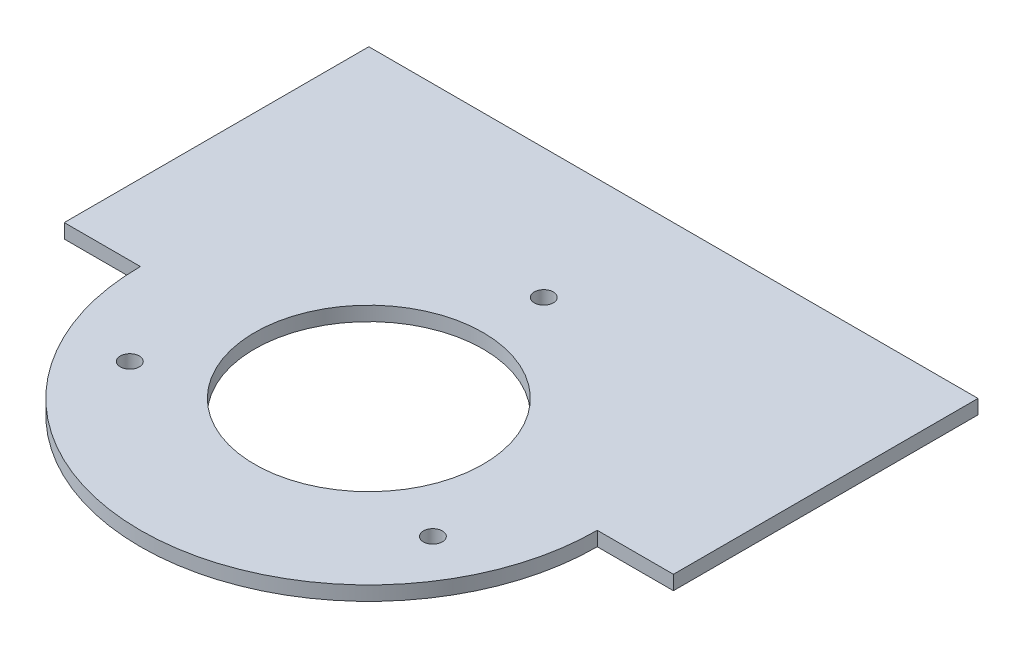
ISO-10303-21;
HEADER;
FILE_DESCRIPTION(('STEP AP214'),'2;1');
FILE_NAME('part.step','',(''),(''),'','','');
FILE_SCHEMA(('AUTOMOTIVE_DESIGN { 1 0 10303 214 1 1 1 1 }'));
ENDSEC;
DATA;
#1=APPLICATION_CONTEXT('core data for automotive mechanical design processes');
#2=APPLICATION_PROTOCOL_DEFINITION('international standard','automotive_design',2000,#1);
#3=PRODUCT_CONTEXT('',#1,'mechanical');
#4=PRODUCT('Part','Part','',(#3));
#5=PRODUCT_RELATED_PRODUCT_CATEGORY('part','',(#4));
#6=PRODUCT_DEFINITION_FORMATION('','',#4);
#7=PRODUCT_DEFINITION_CONTEXT('part definition',#1,'design');
#8=PRODUCT_DEFINITION('design','',#6,#7);
#9=PRODUCT_DEFINITION_SHAPE('','',#8);
#10=(LENGTH_UNIT() NAMED_UNIT(*) SI_UNIT(.MILLI.,.METRE.));
#11=(NAMED_UNIT(*) PLANE_ANGLE_UNIT() SI_UNIT($,.RADIAN.));
#12=(NAMED_UNIT(*) SI_UNIT($,.STERADIAN.) SOLID_ANGLE_UNIT());
#13=UNCERTAINTY_MEASURE_WITH_UNIT(LENGTH_MEASURE(1.E-05),#10,'distance_accuracy_value','');
#14=(GEOMETRIC_REPRESENTATION_CONTEXT(3) GLOBAL_UNCERTAINTY_ASSIGNED_CONTEXT((#13)) GLOBAL_UNIT_ASSIGNED_CONTEXT((#10,
#11,#12)) REPRESENTATION_CONTEXT('',''));
#15=CARTESIAN_POINT('',(0.,0.,0.));
#16=DIRECTION('',(0.,0.,1.));
#17=DIRECTION('',(1.,0.,0.));
#18=AXIS2_PLACEMENT_3D('',#15,#16,#17);
#19=CARTESIAN_POINT('',(0.,4.7625,0.));
#20=DIRECTION('',(0.,1.,0.));
#21=DIRECTION('',(0.,0.,1.));
#22=AXIS2_PLACEMENT_3D('',#19,#20,#21);
#23=PLANE('',#22);
#24=CARTESIAN_POINT('',(50.546,4.7625,29.1827467064591));
#25=DIRECTION('',(0.,1.,0.));
#26=DIRECTION('',(0.,0.,1.));
#27=AXIS2_PLACEMENT_3D('',#24,#25,#26);
#28=CIRCLE('',#27,3.17499999999998);
#29=CARTESIAN_POINT('',(50.546,4.7625,26.0077467064592));
#30=VERTEX_POINT('',#29);
#31=EDGE_CURVE('E189',#30,#30,#28,.T.);
#32=ORIENTED_EDGE('',*,*,#31,.F.);
#33=EDGE_LOOP('',(#32));
#34=FACE_BOUND('',#33,.T.);
#35=CARTESIAN_POINT('',(0.,4.7625,-58.3654934129178));
#36=DIRECTION('',(0.,1.,0.));
#37=DIRECTION('',(0.,0.,1.));
#38=AXIS2_PLACEMENT_3D('',#35,#36,#37);
#39=CIRCLE('',#38,3.175);
#40=CARTESIAN_POINT('',(0.,4.7625,-61.5404934129178));
#41=VERTEX_POINT('',#40);
#42=EDGE_CURVE('E122',#41,#41,#39,.T.);
#43=ORIENTED_EDGE('',*,*,#42,.F.);
#44=EDGE_LOOP('',(#43));
#45=FACE_BOUND('',#44,.T.);
#46=DIRECTION('',(1.,0.,0.));
#47=VECTOR('',#46,1.);
#48=CARTESIAN_POINT('',(-76.2,4.7625,0.));
#49=LINE('',#48,#47);
#50=CARTESIAN_POINT('',(-101.6,4.7625,0.));
#51=VERTEX_POINT('',#50);
#52=CARTESIAN_POINT('',(-76.2,4.7625,0.));
#53=VERTEX_POINT('',#52);
#54=EDGE_CURVE('E129',#51,#53,#49,.T.);
#55=ORIENTED_EDGE('',*,*,#54,.T.);
#56=CARTESIAN_POINT('',(0.,4.7625,0.));
#57=DIRECTION('',(0.,1.,0.));
#58=DIRECTION('',(0.,0.,1.));
#59=AXIS2_PLACEMENT_3D('',#56,#57,#58);
#60=CIRCLE('',#59,76.2);
#61=CARTESIAN_POINT('',(76.2,4.7625,0.));
#62=VERTEX_POINT('',#61);
#63=EDGE_CURVE('E87',#53,#62,#60,.T.);
#64=ORIENTED_EDGE('',*,*,#63,.T.);
#65=DIRECTION('',(1.,0.,0.));
#66=VECTOR('',#65,1.);
#67=CARTESIAN_POINT('',(76.2,4.7625,0.));
#68=LINE('',#67,#66);
#69=CARTESIAN_POINT('',(101.6,4.7625,0.));
#70=VERTEX_POINT('',#69);
#71=EDGE_CURVE('E100',#62,#70,#68,.T.);
#72=ORIENTED_EDGE('',*,*,#71,.T.);
#73=DIRECTION('',(0.,0.,-1.));
#74=VECTOR('',#73,1.);
#75=CARTESIAN_POINT('',(101.6,4.7625,-101.6));
#76=LINE('',#75,#74);
#77=CARTESIAN_POINT('',(101.6,4.7625,-101.6));
#78=VERTEX_POINT('',#77);
#79=EDGE_CURVE('E94',#70,#78,#76,.T.);
#80=ORIENTED_EDGE('',*,*,#79,.T.);
#81=DIRECTION('',(-1.,0.,0.));
#82=VECTOR('',#81,1.);
#83=CARTESIAN_POINT('',(-101.6,4.7625,-101.6));
#84=LINE('',#83,#82);
#85=CARTESIAN_POINT('',(-101.6,4.7625,-101.6));
#86=VERTEX_POINT('',#85);
#87=EDGE_CURVE('E98',#78,#86,#84,.T.);
#88=ORIENTED_EDGE('',*,*,#87,.T.);
#89=DIRECTION('',(0.,0.,1.));
#90=VECTOR('',#89,1.);
#91=CARTESIAN_POINT('',(-101.6,4.7625,0.));
#92=LINE('',#91,#90);
#93=EDGE_CURVE('E50',#86,#51,#92,.T.);
#94=ORIENTED_EDGE('',*,*,#93,.T.);
#95=EDGE_LOOP('',(#55,#64,#72,#80,#88,#94));
#96=FACE_BOUND('',#95,.T.);
#97=CARTESIAN_POINT('',(-50.546,4.7625,29.1827467064592));
#98=DIRECTION('',(0.,1.,0.));
#99=DIRECTION('',(0.,0.,1.));
#100=AXIS2_PLACEMENT_3D('',#97,#98,#99);
#101=CIRCLE('',#100,3.175);
#102=CARTESIAN_POINT('',(-50.546,4.7625,26.0077467064592));
#103=VERTEX_POINT('',#102);
#104=EDGE_CURVE('E195',#103,#103,#101,.T.);
#105=ORIENTED_EDGE('',*,*,#104,.F.);
#106=EDGE_LOOP('',(#105));
#107=FACE_BOUND('',#106,.T.);
#108=CARTESIAN_POINT('',(0.,4.7625,0.));
#109=DIRECTION('',(0.,1.,0.));
#110=DIRECTION('',(0.,0.,1.));
#111=AXIS2_PLACEMENT_3D('',#108,#109,#110);
#112=CIRCLE('',#111,38.1);
#113=CARTESIAN_POINT('',(0.,4.7625,-38.1));
#114=VERTEX_POINT('',#113);
#115=EDGE_CURVE('E180',#114,#114,#112,.T.);
#116=ORIENTED_EDGE('',*,*,#115,.F.);
#117=EDGE_LOOP('',(#116));
#118=FACE_BOUND('',#117,.T.);
#119=ADVANCED_FACE('F33',(#34,#45,#96,#107,#118),#23,.T.);
#120=CARTESIAN_POINT('',(0.,0.,0.));
#121=DIRECTION('',(0.,1.,0.));
#122=DIRECTION('',(0.,0.,1.));
#123=AXIS2_PLACEMENT_3D('',#120,#121,#122);
#124=PLANE('',#123);
#125=DIRECTION('',(1.,0.,0.));
#126=VECTOR('',#125,1.);
#127=CARTESIAN_POINT('',(-76.2,0.,0.));
#128=LINE('',#127,#126);
#129=CARTESIAN_POINT('',(-101.6,0.,0.));
#130=VERTEX_POINT('',#129);
#131=CARTESIAN_POINT('',(-76.2,0.,0.));
#132=VERTEX_POINT('',#131);
#133=EDGE_CURVE('E118',#130,#132,#128,.T.);
#134=ORIENTED_EDGE('',*,*,#133,.F.);
#135=DIRECTION('',(0.,0.,1.));
#136=VECTOR('',#135,1.);
#137=CARTESIAN_POINT('',(-101.6,0.,0.));
#138=LINE('',#137,#136);
#139=CARTESIAN_POINT('',(-101.6,0.,-101.6));
#140=VERTEX_POINT('',#139);
#141=EDGE_CURVE('E79',#140,#130,#138,.T.);
#142=ORIENTED_EDGE('',*,*,#141,.F.);
#143=DIRECTION('',(-1.,0.,0.));
#144=VECTOR('',#143,1.);
#145=CARTESIAN_POINT('',(-101.6,0.,-101.6));
#146=LINE('',#145,#144);
#147=CARTESIAN_POINT('',(101.6,0.,-101.6));
#148=VERTEX_POINT('',#147);
#149=EDGE_CURVE('E73',#148,#140,#146,.T.);
#150=ORIENTED_EDGE('',*,*,#149,.F.);
#151=DIRECTION('',(0.,0.,-1.));
#152=VECTOR('',#151,1.);
#153=CARTESIAN_POINT('',(101.6,0.,-101.6));
#154=LINE('',#153,#152);
#155=CARTESIAN_POINT('',(101.6,0.,0.));
#156=VERTEX_POINT('',#155);
#157=EDGE_CURVE('E108',#156,#148,#154,.T.);
#158=ORIENTED_EDGE('',*,*,#157,.F.);
#159=DIRECTION('',(1.,0.,0.));
#160=VECTOR('',#159,1.);
#161=CARTESIAN_POINT('',(76.2,0.,0.));
#162=LINE('',#161,#160);
#163=CARTESIAN_POINT('',(76.2,0.,0.));
#164=VERTEX_POINT('',#163);
#165=EDGE_CURVE('E124',#164,#156,#162,.T.);
#166=ORIENTED_EDGE('',*,*,#165,.F.);
#167=CARTESIAN_POINT('',(0.,0.,0.));
#168=DIRECTION('',(0.,1.,0.));
#169=DIRECTION('',(0.,0.,1.));
#170=AXIS2_PLACEMENT_3D('',#167,#168,#169);
#171=CIRCLE('',#170,76.2);
#172=EDGE_CURVE('E121',#132,#164,#171,.T.);
#173=ORIENTED_EDGE('',*,*,#172,.F.);
#174=EDGE_LOOP('',(#134,#142,#150,#158,#166,#173));
#175=FACE_BOUND('',#174,.T.);
#176=CARTESIAN_POINT('',(0.,0.,-58.3654934129178));
#177=DIRECTION('',(0.,1.,0.));
#178=DIRECTION('',(0.,0.,1.));
#179=AXIS2_PLACEMENT_3D('',#176,#177,#178);
#180=CIRCLE('',#179,3.175);
#181=CARTESIAN_POINT('',(0.,0.,-61.5404934129178));
#182=VERTEX_POINT('',#181);
#183=EDGE_CURVE('E198',#182,#182,#180,.T.);
#184=ORIENTED_EDGE('',*,*,#183,.T.);
#185=EDGE_LOOP('',(#184));
#186=FACE_BOUND('',#185,.T.);
#187=CARTESIAN_POINT('',(-50.546,0.,29.1827467064592));
#188=DIRECTION('',(0.,1.,0.));
#189=DIRECTION('',(0.,0.,1.));
#190=AXIS2_PLACEMENT_3D('',#187,#188,#189);
#191=CIRCLE('',#190,3.175);
#192=CARTESIAN_POINT('',(-50.546,0.,26.0077467064592));
#193=VERTEX_POINT('',#192);
#194=EDGE_CURVE('E192',#193,#193,#191,.T.);
#195=ORIENTED_EDGE('',*,*,#194,.T.);
#196=EDGE_LOOP('',(#195));
#197=FACE_BOUND('',#196,.T.);
#198=CARTESIAN_POINT('',(50.546,0.,29.1827467064591));
#199=DIRECTION('',(0.,1.,0.));
#200=DIRECTION('',(0.,0.,1.));
#201=AXIS2_PLACEMENT_3D('',#198,#199,#200);
#202=CIRCLE('',#201,3.17499999999998);
#203=CARTESIAN_POINT('',(50.546,0.,26.0077467064592));
#204=VERTEX_POINT('',#203);
#205=EDGE_CURVE('E186',#204,#204,#202,.T.);
#206=ORIENTED_EDGE('',*,*,#205,.T.);
#207=EDGE_LOOP('',(#206));
#208=FACE_BOUND('',#207,.T.);
#209=CARTESIAN_POINT('',(0.,0.,0.));
#210=DIRECTION('',(0.,1.,0.));
#211=DIRECTION('',(0.,0.,1.));
#212=AXIS2_PLACEMENT_3D('',#209,#210,#211);
#213=CIRCLE('',#212,38.1);
#214=CARTESIAN_POINT('',(0.,0.,-38.1));
#215=VERTEX_POINT('',#214);
#216=EDGE_CURVE('E183',#215,#215,#213,.T.);
#217=ORIENTED_EDGE('',*,*,#216,.T.);
#218=EDGE_LOOP('',(#217));
#219=FACE_BOUND('',#218,.T.);
#220=ADVANCED_FACE('F138',(#175,#186,#197,#208,#219),#124,.F.);
#221=CARTESIAN_POINT('',(-76.2,4.7625,0.));
#222=DIRECTION('',(0.,0.,-1.));
#223=DIRECTION('',(-1.,0.,0.));
#224=AXIS2_PLACEMENT_3D('',#221,#222,#223);
#225=PLANE('',#224);
#226=ORIENTED_EDGE('',*,*,#133,.T.);
#227=DIRECTION('',(0.,-1.,0.));
#228=VECTOR('',#227,1.);
#229=CARTESIAN_POINT('',(-76.2,4.7625,0.));
#230=LINE('',#229,#228);
#231=EDGE_CURVE('E11',#53,#132,#230,.T.);
#232=ORIENTED_EDGE('',*,*,#231,.F.);
#233=ORIENTED_EDGE('',*,*,#54,.F.);
#234=DIRECTION('',(0.,-1.,0.));
#235=VECTOR('',#234,1.);
#236=CARTESIAN_POINT('',(-101.6,4.7625,0.));
#237=LINE('',#236,#235);
#238=EDGE_CURVE('E114',#51,#130,#237,.T.);
#239=ORIENTED_EDGE('',*,*,#238,.T.);
#240=EDGE_LOOP('',(#226,#232,#233,#239));
#241=FACE_BOUND('',#240,.T.);
#242=ADVANCED_FACE('F35',(#241),#225,.F.);
#243=CARTESIAN_POINT('',(0.,4.7625,0.));
#244=DIRECTION('',(0.,-1.,0.));
#245=DIRECTION('',(0.,0.,-1.));
#246=AXIS2_PLACEMENT_3D('',#243,#244,#245);
#247=CYLINDRICAL_SURFACE('',#246,76.2);
#248=ORIENTED_EDGE('',*,*,#172,.T.);
#249=DIRECTION('',(0.,-1.,0.));
#250=VECTOR('',#249,1.);
#251=CARTESIAN_POINT('',(76.2,4.7625,0.));
#252=LINE('',#251,#250);
#253=EDGE_CURVE('E42',#62,#164,#252,.T.);
#254=ORIENTED_EDGE('',*,*,#253,.F.);
#255=ORIENTED_EDGE('',*,*,#63,.F.);
#256=ORIENTED_EDGE('',*,*,#231,.T.);
#257=EDGE_LOOP('',(#248,#254,#255,#256));
#258=FACE_BOUND('',#257,.T.);
#259=ADVANCED_FACE('F256',(#258),#247,.T.);
#260=CARTESIAN_POINT('',(76.2,4.7625,0.));
#261=DIRECTION('',(0.,0.,-1.));
#262=DIRECTION('',(-1.,0.,0.));
#263=AXIS2_PLACEMENT_3D('',#260,#261,#262);
#264=PLANE('',#263);
#265=ORIENTED_EDGE('',*,*,#165,.T.);
#266=DIRECTION('',(0.,-1.,0.));
#267=VECTOR('',#266,1.);
#268=CARTESIAN_POINT('',(101.6,4.7625,0.));
#269=LINE('',#268,#267);
#270=EDGE_CURVE('E109',#70,#156,#269,.T.);
#271=ORIENTED_EDGE('',*,*,#270,.F.);
#272=ORIENTED_EDGE('',*,*,#71,.F.);
#273=ORIENTED_EDGE('',*,*,#253,.T.);
#274=EDGE_LOOP('',(#265,#271,#272,#273));
#275=FACE_BOUND('',#274,.T.);
#276=ADVANCED_FACE('F135',(#275),#264,.F.);
#277=CARTESIAN_POINT('',(101.6,4.7625,-101.6));
#278=DIRECTION('',(-1.,0.,0.));
#279=DIRECTION('',(0.,0.,1.));
#280=AXIS2_PLACEMENT_3D('',#277,#278,#279);
#281=PLANE('',#280);
#282=ORIENTED_EDGE('',*,*,#157,.T.);
#283=DIRECTION('',(0.,-1.,0.));
#284=VECTOR('',#283,1.);
#285=CARTESIAN_POINT('',(101.6,4.7625,-101.6));
#286=LINE('',#285,#284);
#287=EDGE_CURVE('E105',#78,#148,#286,.T.);
#288=ORIENTED_EDGE('',*,*,#287,.F.);
#289=ORIENTED_EDGE('',*,*,#79,.F.);
#290=ORIENTED_EDGE('',*,*,#270,.T.);
#291=EDGE_LOOP('',(#282,#288,#289,#290));
#292=FACE_BOUND('',#291,.T.);
#293=ADVANCED_FACE('F106',(#292),#281,.F.);
#294=CARTESIAN_POINT('',(-101.6,4.7625,-101.6));
#295=DIRECTION('',(0.,0.,1.));
#296=DIRECTION('',(1.,0.,0.));
#297=AXIS2_PLACEMENT_3D('',#294,#295,#296);
#298=PLANE('',#297);
#299=ORIENTED_EDGE('',*,*,#149,.T.);
#300=DIRECTION('',(0.,-1.,0.));
#301=VECTOR('',#300,1.);
#302=CARTESIAN_POINT('',(-101.6,4.7625,-101.6));
#303=LINE('',#302,#301);
#304=EDGE_CURVE('E110',#86,#140,#303,.T.);
#305=ORIENTED_EDGE('',*,*,#304,.F.);
#306=ORIENTED_EDGE('',*,*,#87,.F.);
#307=ORIENTED_EDGE('',*,*,#287,.T.);
#308=EDGE_LOOP('',(#299,#305,#306,#307));
#309=FACE_BOUND('',#308,.T.);
#310=ADVANCED_FACE('F112',(#309),#298,.F.);
#311=CARTESIAN_POINT('',(-101.6,4.7625,0.));
#312=DIRECTION('',(1.,0.,0.));
#313=DIRECTION('',(0.,0.,-1.));
#314=AXIS2_PLACEMENT_3D('',#311,#312,#313);
#315=PLANE('',#314);
#316=ORIENTED_EDGE('',*,*,#141,.T.);
#317=ORIENTED_EDGE('',*,*,#238,.F.);
#318=ORIENTED_EDGE('',*,*,#93,.F.);
#319=ORIENTED_EDGE('',*,*,#304,.T.);
#320=EDGE_LOOP('',(#316,#317,#318,#319));
#321=FACE_BOUND('',#320,.T.);
#322=ADVANCED_FACE('F143',(#321),#315,.F.);
#323=CARTESIAN_POINT('',(0.,4.7625,-58.3654934129178));
#324=DIRECTION('',(0.,-1.,0.));
#325=DIRECTION('',(0.,0.,-1.));
#326=AXIS2_PLACEMENT_3D('',#323,#324,#325);
#327=CYLINDRICAL_SURFACE('',#326,3.175);
#328=CARTESIAN_POINT('',(0.,4.7625,-61.5404934129178));
#329=CARTESIAN_POINT('',(0.,4.712890625,-61.5404934129178));
#330=CARTESIAN_POINT('',(0.,4.66328125,-61.5404934129178));
#331=CARTESIAN_POINT('',(0.,4.5640625,-61.5404934129178));
#332=CARTESIAN_POINT('',(0.,4.514453125,-61.5404934129178));
#333=CARTESIAN_POINT('',(0.,4.415234375,-61.5404934129178));
#334=CARTESIAN_POINT('',(0.,4.365625,-61.5404934129178));
#335=CARTESIAN_POINT('',(0.,4.26640625,-61.5404934129178));
#336=CARTESIAN_POINT('',(0.,4.216796875,-61.5404934129178));
#337=CARTESIAN_POINT('',(0.,4.117578125,-61.5404934129178));
#338=CARTESIAN_POINT('',(0.,4.06796875,-61.5404934129178));
#339=CARTESIAN_POINT('',(0.,3.96875,-61.5404934129178));
#340=CARTESIAN_POINT('',(0.,3.919140625,-61.5404934129178));
#341=CARTESIAN_POINT('',(0.,3.819921875,-61.5404934129178));
#342=CARTESIAN_POINT('',(0.,3.7703125,-61.5404934129178));
#343=CARTESIAN_POINT('',(0.,3.67109375,-61.5404934129178));
#344=CARTESIAN_POINT('',(0.,3.621484375,-61.5404934129178));
#345=CARTESIAN_POINT('',(0.,3.522265625,-61.5404934129178));
#346=CARTESIAN_POINT('',(0.,3.47265625,-61.5404934129178));
#347=CARTESIAN_POINT('',(0.,3.3734375,-61.5404934129178));
#348=CARTESIAN_POINT('',(0.,3.323828125,-61.5404934129178));
#349=CARTESIAN_POINT('',(0.,3.224609375,-61.5404934129178));
#350=CARTESIAN_POINT('',(0.,3.175,-61.5404934129178));
#351=CARTESIAN_POINT('',(0.,3.07578125,-61.5404934129178));
#352=CARTESIAN_POINT('',(0.,3.026171875,-61.5404934129178));
#353=CARTESIAN_POINT('',(0.,2.926953125,-61.5404934129178));
#354=CARTESIAN_POINT('',(0.,2.87734375,-61.5404934129178));
#355=CARTESIAN_POINT('',(0.,2.778125,-61.5404934129178));
#356=CARTESIAN_POINT('',(0.,2.728515625,-61.5404934129178));
#357=CARTESIAN_POINT('',(0.,2.629296875,-61.5404934129178));
#358=CARTESIAN_POINT('',(0.,2.5796875,-61.5404934129178));
#359=CARTESIAN_POINT('',(0.,2.48046875,-61.5404934129178));
#360=CARTESIAN_POINT('',(0.,2.430859375,-61.5404934129178));
#361=CARTESIAN_POINT('',(0.,2.331640625,-61.5404934129178));
#362=CARTESIAN_POINT('',(0.,2.28203125,-61.5404934129178));
#363=CARTESIAN_POINT('',(0.,2.1828125,-61.5404934129178));
#364=CARTESIAN_POINT('',(0.,2.133203125,-61.5404934129178));
#365=CARTESIAN_POINT('',(0.,2.033984375,-61.5404934129178));
#366=CARTESIAN_POINT('',(0.,1.984375,-61.5404934129178));
#367=CARTESIAN_POINT('',(0.,1.88515625,-61.5404934129178));
#368=CARTESIAN_POINT('',(0.,1.835546875,-61.5404934129178));
#369=CARTESIAN_POINT('',(0.,1.736328125,-61.5404934129178));
#370=CARTESIAN_POINT('',(0.,1.68671875,-61.5404934129178));
#371=CARTESIAN_POINT('',(0.,1.5875,-61.5404934129178));
#372=CARTESIAN_POINT('',(0.,1.537890625,-61.5404934129178));
#373=CARTESIAN_POINT('',(0.,1.438671875,-61.5404934129178));
#374=CARTESIAN_POINT('',(0.,1.3890625,-61.5404934129178));
#375=CARTESIAN_POINT('',(0.,1.28984375,-61.5404934129178));
#376=CARTESIAN_POINT('',(0.,1.240234375,-61.5404934129178));
#377=CARTESIAN_POINT('',(0.,1.141015625,-61.5404934129178));
#378=CARTESIAN_POINT('',(0.,1.09140625,-61.5404934129178));
#379=CARTESIAN_POINT('',(0.,0.9921875,-61.5404934129178));
#380=CARTESIAN_POINT('',(0.,0.942578125,-61.5404934129178));
#381=CARTESIAN_POINT('',(0.,0.843359375,-61.5404934129178));
#382=CARTESIAN_POINT('',(0.,0.79375,-61.5404934129178));
#383=CARTESIAN_POINT('',(0.,0.69453125,-61.5404934129178));
#384=CARTESIAN_POINT('',(0.,0.644921875,-61.5404934129178));
#385=CARTESIAN_POINT('',(0.,0.545703125,-61.5404934129178));
#386=CARTESIAN_POINT('',(0.,0.49609375,-61.5404934129178));
#387=CARTESIAN_POINT('',(0.,0.396875,-61.5404934129178));
#388=CARTESIAN_POINT('',(0.,0.347265625,-61.5404934129178));
#389=CARTESIAN_POINT('',(0.,0.248046875,-61.5404934129178));
#390=CARTESIAN_POINT('',(0.,0.1984375,-61.5404934129178));
#391=CARTESIAN_POINT('',(0.,0.09921875,-61.5404934129178));
#392=CARTESIAN_POINT('',(0.,0.049609375,-61.5404934129178));
#393=CARTESIAN_POINT('',(0.,0.,-61.5404934129178));
#394=B_SPLINE_CURVE_WITH_KNOTS('',3,(#328,#329,#330,#331,#332,#333,#334,#335,#336,#337,#338,
#339,#340,#341,#342,#343,#344,#345,#346,#347,#348,#349,#350,#351,#352,#353,#354,#355,#356,#357,
#358,#359,#360,#361,#362,#363,#364,#365,#366,#367,#368,#369,#370,#371,#372,#373,#374,#375,#376,
#377,#378,#379,#380,#381,#382,#383,#384,#385,#386,#387,#388,#389,#390,#391,#392,#393),
.UNSPECIFIED.,.F.,.F.,(4,2,2,2,2,2,2,2,2,2,2,2,2,2,2,2,2,2,2,2,2,2,2,2,2,2,2,2,2,2,2,2,4),(0.,
0.148828124999999,0.297656249999999,0.446484374999999,0.595312499999999,0.744140625,0.89296875,
1.041796875,1.190625,1.339453125,1.48828125,1.637109375,1.7859375,1.934765625,2.08359375,
2.232421875,2.38125,2.530078125,2.67890625,2.827734375,2.9765625,3.125390625,3.27421875,
3.423046875,3.571875,3.720703125,3.86953125,4.018359375,4.1671875,4.316015625,4.46484375,
4.613671875,4.7625),.UNSPECIFIED.);
#395=EDGE_CURVE('BSEAM145',#41,#182,#394,.T.);
#396=ORIENTED_EDGE('',*,*,#42,.T.);
#397=ORIENTED_EDGE('',*,*,#183,.F.);
#398=ORIENTED_EDGE('',*,*,#395,.T.);
#399=ORIENTED_EDGE('',*,*,#395,.F.);
#400=EDGE_LOOP('',(#396,#398,#397,#399));
#401=FACE_BOUND('',#400,.T.);
#402=ADVANCED_FACE('F145',(#401),#327,.F.);
#403=CARTESIAN_POINT('',(-50.546,4.7625,29.1827467064592));
#404=DIRECTION('',(0.,-1.,0.));
#405=DIRECTION('',(0.,0.,-1.));
#406=AXIS2_PLACEMENT_3D('',#403,#404,#405);
#407=CYLINDRICAL_SURFACE('',#406,3.175);
#408=CARTESIAN_POINT('',(-50.546,4.7625,26.0077467064592));
#409=CARTESIAN_POINT('',(-50.546,4.712890625,26.0077467064592));
#410=CARTESIAN_POINT('',(-50.546,4.66328125,26.0077467064592));
#411=CARTESIAN_POINT('',(-50.546,4.5640625,26.0077467064592));
#412=CARTESIAN_POINT('',(-50.546,4.514453125,26.0077467064592));
#413=CARTESIAN_POINT('',(-50.546,4.415234375,26.0077467064592));
#414=CARTESIAN_POINT('',(-50.546,4.365625,26.0077467064592));
#415=CARTESIAN_POINT('',(-50.546,4.26640625,26.0077467064592));
#416=CARTESIAN_POINT('',(-50.546,4.216796875,26.0077467064592));
#417=CARTESIAN_POINT('',(-50.546,4.117578125,26.0077467064592));
#418=CARTESIAN_POINT('',(-50.546,4.06796875,26.0077467064592));
#419=CARTESIAN_POINT('',(-50.546,3.96875,26.0077467064592));
#420=CARTESIAN_POINT('',(-50.546,3.919140625,26.0077467064592));
#421=CARTESIAN_POINT('',(-50.546,3.819921875,26.0077467064592));
#422=CARTESIAN_POINT('',(-50.546,3.7703125,26.0077467064592));
#423=CARTESIAN_POINT('',(-50.546,3.67109375,26.0077467064592));
#424=CARTESIAN_POINT('',(-50.546,3.621484375,26.0077467064592));
#425=CARTESIAN_POINT('',(-50.546,3.522265625,26.0077467064592));
#426=CARTESIAN_POINT('',(-50.546,3.47265625,26.0077467064592));
#427=CARTESIAN_POINT('',(-50.546,3.3734375,26.0077467064592));
#428=CARTESIAN_POINT('',(-50.546,3.323828125,26.0077467064592));
#429=CARTESIAN_POINT('',(-50.546,3.224609375,26.0077467064592));
#430=CARTESIAN_POINT('',(-50.546,3.175,26.0077467064592));
#431=CARTESIAN_POINT('',(-50.546,3.07578125,26.0077467064592));
#432=CARTESIAN_POINT('',(-50.546,3.026171875,26.0077467064592));
#433=CARTESIAN_POINT('',(-50.546,2.926953125,26.0077467064592));
#434=CARTESIAN_POINT('',(-50.546,2.87734375,26.0077467064592));
#435=CARTESIAN_POINT('',(-50.546,2.778125,26.0077467064592));
#436=CARTESIAN_POINT('',(-50.546,2.728515625,26.0077467064592));
#437=CARTESIAN_POINT('',(-50.546,2.629296875,26.0077467064592));
#438=CARTESIAN_POINT('',(-50.546,2.5796875,26.0077467064592));
#439=CARTESIAN_POINT('',(-50.546,2.48046875,26.0077467064592));
#440=CARTESIAN_POINT('',(-50.546,2.430859375,26.0077467064592));
#441=CARTESIAN_POINT('',(-50.546,2.331640625,26.0077467064592));
#442=CARTESIAN_POINT('',(-50.546,2.28203125,26.0077467064592));
#443=CARTESIAN_POINT('',(-50.546,2.1828125,26.0077467064592));
#444=CARTESIAN_POINT('',(-50.546,2.133203125,26.0077467064592));
#445=CARTESIAN_POINT('',(-50.546,2.033984375,26.0077467064592));
#446=CARTESIAN_POINT('',(-50.546,1.984375,26.0077467064592));
#447=CARTESIAN_POINT('',(-50.546,1.88515625,26.0077467064592));
#448=CARTESIAN_POINT('',(-50.546,1.835546875,26.0077467064592));
#449=CARTESIAN_POINT('',(-50.546,1.736328125,26.0077467064592));
#450=CARTESIAN_POINT('',(-50.546,1.68671875,26.0077467064592));
#451=CARTESIAN_POINT('',(-50.546,1.5875,26.0077467064592));
#452=CARTESIAN_POINT('',(-50.546,1.537890625,26.0077467064592));
#453=CARTESIAN_POINT('',(-50.546,1.438671875,26.0077467064592));
#454=CARTESIAN_POINT('',(-50.546,1.3890625,26.0077467064592));
#455=CARTESIAN_POINT('',(-50.546,1.28984375,26.0077467064592));
#456=CARTESIAN_POINT('',(-50.546,1.240234375,26.0077467064592));
#457=CARTESIAN_POINT('',(-50.546,1.141015625,26.0077467064592));
#458=CARTESIAN_POINT('',(-50.546,1.09140625,26.0077467064592));
#459=CARTESIAN_POINT('',(-50.546,0.9921875,26.0077467064592));
#460=CARTESIAN_POINT('',(-50.546,0.942578125,26.0077467064592));
#461=CARTESIAN_POINT('',(-50.546,0.843359375,26.0077467064592));
#462=CARTESIAN_POINT('',(-50.546,0.79375,26.0077467064592));
#463=CARTESIAN_POINT('',(-50.546,0.69453125,26.0077467064592));
#464=CARTESIAN_POINT('',(-50.546,0.644921875,26.0077467064592));
#465=CARTESIAN_POINT('',(-50.546,0.545703125,26.0077467064592));
#466=CARTESIAN_POINT('',(-50.546,0.49609375,26.0077467064592));
#467=CARTESIAN_POINT('',(-50.546,0.396875,26.0077467064592));
#468=CARTESIAN_POINT('',(-50.546,0.347265625,26.0077467064592));
#469=CARTESIAN_POINT('',(-50.546,0.248046875,26.0077467064592));
#470=CARTESIAN_POINT('',(-50.546,0.1984375,26.0077467064592));
#471=CARTESIAN_POINT('',(-50.546,0.09921875,26.0077467064592));
#472=CARTESIAN_POINT('',(-50.546,0.049609375,26.0077467064592));
#473=CARTESIAN_POINT('',(-50.546,0.,26.0077467064592));
#474=B_SPLINE_CURVE_WITH_KNOTS('',3,(#408,#409,#410,#411,#412,#413,#414,#415,#416,#417,#418,
#419,#420,#421,#422,#423,#424,#425,#426,#427,#428,#429,#430,#431,#432,#433,#434,#435,#436,#437,
#438,#439,#440,#441,#442,#443,#444,#445,#446,#447,#448,#449,#450,#451,#452,#453,#454,#455,#456,
#457,#458,#459,#460,#461,#462,#463,#464,#465,#466,#467,#468,#469,#470,#471,#472,#473),
.UNSPECIFIED.,.F.,.F.,(4,2,2,2,2,2,2,2,2,2,2,2,2,2,2,2,2,2,2,2,2,2,2,2,2,2,2,2,2,2,2,2,4),(0.,
0.148828124999999,0.297656249999999,0.446484374999999,0.595312499999999,0.744140625,0.89296875,
1.041796875,1.190625,1.339453125,1.48828125,1.637109375,1.7859375,1.934765625,2.08359375,
2.232421875,2.38125,2.530078125,2.67890625,2.827734375,2.9765625,3.125390625,3.27421875,
3.423046875,3.571875,3.720703125,3.86953125,4.018359375,4.1671875,4.316015625,4.46484375,
4.613671875,4.7625),.UNSPECIFIED.);
#475=EDGE_CURVE('BSEAM151',#103,#193,#474,.T.);
#476=ORIENTED_EDGE('',*,*,#104,.T.);
#477=ORIENTED_EDGE('',*,*,#194,.F.);
#478=ORIENTED_EDGE('',*,*,#475,.T.);
#479=ORIENTED_EDGE('',*,*,#475,.F.);
#480=EDGE_LOOP('',(#476,#478,#477,#479));
#481=FACE_BOUND('',#480,.T.);
#482=ADVANCED_FACE('F151',(#481),#407,.F.);
#483=CARTESIAN_POINT('',(50.546,4.7625,29.1827467064591));
#484=DIRECTION('',(0.,-1.,0.));
#485=DIRECTION('',(0.,0.,-1.));
#486=AXIS2_PLACEMENT_3D('',#483,#484,#485);
#487=CYLINDRICAL_SURFACE('',#486,3.17499999999998);
#488=CARTESIAN_POINT('',(50.546,4.7625,26.0077467064592));
#489=CARTESIAN_POINT('',(50.546,4.712890625,26.0077467064592));
#490=CARTESIAN_POINT('',(50.546,4.66328125,26.0077467064592));
#491=CARTESIAN_POINT('',(50.546,4.5640625,26.0077467064592));
#492=CARTESIAN_POINT('',(50.546,4.514453125,26.0077467064592));
#493=CARTESIAN_POINT('',(50.546,4.415234375,26.0077467064592));
#494=CARTESIAN_POINT('',(50.546,4.365625,26.0077467064592));
#495=CARTESIAN_POINT('',(50.546,4.26640625,26.0077467064592));
#496=CARTESIAN_POINT('',(50.546,4.216796875,26.0077467064592));
#497=CARTESIAN_POINT('',(50.546,4.117578125,26.0077467064592));
#498=CARTESIAN_POINT('',(50.546,4.06796875,26.0077467064592));
#499=CARTESIAN_POINT('',(50.546,3.96875,26.0077467064592));
#500=CARTESIAN_POINT('',(50.546,3.919140625,26.0077467064592));
#501=CARTESIAN_POINT('',(50.546,3.819921875,26.0077467064592));
#502=CARTESIAN_POINT('',(50.546,3.7703125,26.0077467064592));
#503=CARTESIAN_POINT('',(50.546,3.67109375,26.0077467064592));
#504=CARTESIAN_POINT('',(50.546,3.621484375,26.0077467064592));
#505=CARTESIAN_POINT('',(50.546,3.522265625,26.0077467064592));
#506=CARTESIAN_POINT('',(50.546,3.47265625,26.0077467064592));
#507=CARTESIAN_POINT('',(50.546,3.3734375,26.0077467064592));
#508=CARTESIAN_POINT('',(50.546,3.323828125,26.0077467064592));
#509=CARTESIAN_POINT('',(50.546,3.224609375,26.0077467064592));
#510=CARTESIAN_POINT('',(50.546,3.175,26.0077467064592));
#511=CARTESIAN_POINT('',(50.546,3.07578125,26.0077467064592));
#512=CARTESIAN_POINT('',(50.546,3.026171875,26.0077467064592));
#513=CARTESIAN_POINT('',(50.546,2.926953125,26.0077467064592));
#514=CARTESIAN_POINT('',(50.546,2.87734375,26.0077467064592));
#515=CARTESIAN_POINT('',(50.546,2.778125,26.0077467064592));
#516=CARTESIAN_POINT('',(50.546,2.728515625,26.0077467064592));
#517=CARTESIAN_POINT('',(50.546,2.629296875,26.0077467064592));
#518=CARTESIAN_POINT('',(50.546,2.5796875,26.0077467064592));
#519=CARTESIAN_POINT('',(50.546,2.48046875,26.0077467064592));
#520=CARTESIAN_POINT('',(50.546,2.430859375,26.0077467064592));
#521=CARTESIAN_POINT('',(50.546,2.331640625,26.0077467064592));
#522=CARTESIAN_POINT('',(50.546,2.28203125,26.0077467064592));
#523=CARTESIAN_POINT('',(50.546,2.1828125,26.0077467064592));
#524=CARTESIAN_POINT('',(50.546,2.133203125,26.0077467064592));
#525=CARTESIAN_POINT('',(50.546,2.033984375,26.0077467064592));
#526=CARTESIAN_POINT('',(50.546,1.984375,26.0077467064592));
#527=CARTESIAN_POINT('',(50.546,1.88515625,26.0077467064592));
#528=CARTESIAN_POINT('',(50.546,1.835546875,26.0077467064592));
#529=CARTESIAN_POINT('',(50.546,1.736328125,26.0077467064592));
#530=CARTESIAN_POINT('',(50.546,1.68671875,26.0077467064592));
#531=CARTESIAN_POINT('',(50.546,1.5875,26.0077467064592));
#532=CARTESIAN_POINT('',(50.546,1.537890625,26.0077467064592));
#533=CARTESIAN_POINT('',(50.546,1.438671875,26.0077467064592));
#534=CARTESIAN_POINT('',(50.546,1.3890625,26.0077467064592));
#535=CARTESIAN_POINT('',(50.546,1.28984375,26.0077467064592));
#536=CARTESIAN_POINT('',(50.546,1.240234375,26.0077467064592));
#537=CARTESIAN_POINT('',(50.546,1.141015625,26.0077467064592));
#538=CARTESIAN_POINT('',(50.546,1.09140625,26.0077467064592));
#539=CARTESIAN_POINT('',(50.546,0.9921875,26.0077467064592));
#540=CARTESIAN_POINT('',(50.546,0.942578125,26.0077467064592));
#541=CARTESIAN_POINT('',(50.546,0.843359375,26.0077467064592));
#542=CARTESIAN_POINT('',(50.546,0.79375,26.0077467064592));
#543=CARTESIAN_POINT('',(50.546,0.69453125,26.0077467064592));
#544=CARTESIAN_POINT('',(50.546,0.644921875,26.0077467064592));
#545=CARTESIAN_POINT('',(50.546,0.545703125,26.0077467064592));
#546=CARTESIAN_POINT('',(50.546,0.49609375,26.0077467064592));
#547=CARTESIAN_POINT('',(50.546,0.396875,26.0077467064592));
#548=CARTESIAN_POINT('',(50.546,0.347265625,26.0077467064592));
#549=CARTESIAN_POINT('',(50.546,0.248046875,26.0077467064592));
#550=CARTESIAN_POINT('',(50.546,0.1984375,26.0077467064592));
#551=CARTESIAN_POINT('',(50.546,0.09921875,26.0077467064592));
#552=CARTESIAN_POINT('',(50.546,0.049609375,26.0077467064592));
#553=CARTESIAN_POINT('',(50.546,0.,26.0077467064592));
#554=B_SPLINE_CURVE_WITH_KNOTS('',3,(#488,#489,#490,#491,#492,#493,#494,#495,#496,#497,#498,
#499,#500,#501,#502,#503,#504,#505,#506,#507,#508,#509,#510,#511,#512,#513,#514,#515,#516,#517,
#518,#519,#520,#521,#522,#523,#524,#525,#526,#527,#528,#529,#530,#531,#532,#533,#534,#535,#536,
#537,#538,#539,#540,#541,#542,#543,#544,#545,#546,#547,#548,#549,#550,#551,#552,#553),
.UNSPECIFIED.,.F.,.F.,(4,2,2,2,2,2,2,2,2,2,2,2,2,2,2,2,2,2,2,2,2,2,2,2,2,2,2,2,2,2,2,2,4),(0.,
0.148828124999999,0.297656249999999,0.446484374999999,0.595312499999999,0.744140625,0.89296875,
1.041796875,1.190625,1.339453125,1.48828125,1.637109375,1.7859375,1.934765625,2.08359375,
2.232421875,2.38125,2.530078125,2.67890625,2.827734375,2.9765625,3.125390625,3.27421875,
3.423046875,3.571875,3.720703125,3.86953125,4.018359375,4.1671875,4.316015625,4.46484375,
4.613671875,4.7625),.UNSPECIFIED.);
#555=EDGE_CURVE('BSEAM167',#30,#204,#554,.T.);
#556=ORIENTED_EDGE('',*,*,#31,.T.);
#557=ORIENTED_EDGE('',*,*,#205,.F.);
#558=ORIENTED_EDGE('',*,*,#555,.T.);
#559=ORIENTED_EDGE('',*,*,#555,.F.);
#560=EDGE_LOOP('',(#556,#558,#557,#559));
#561=FACE_BOUND('',#560,.T.);
#562=ADVANCED_FACE('F167',(#561),#487,.F.);
#563=CARTESIAN_POINT('',(0.,4.7625,0.));
#564=DIRECTION('',(0.,-1.,0.));
#565=DIRECTION('',(0.,0.,-1.));
#566=AXIS2_PLACEMENT_3D('',#563,#564,#565);
#567=CYLINDRICAL_SURFACE('',#566,38.1);
#568=CARTESIAN_POINT('',(0.,4.7625,-38.1));
#569=CARTESIAN_POINT('',(0.,4.712890625,-38.1));
#570=CARTESIAN_POINT('',(0.,4.66328125,-38.1));
#571=CARTESIAN_POINT('',(0.,4.5640625,-38.1));
#572=CARTESIAN_POINT('',(0.,4.514453125,-38.1));
#573=CARTESIAN_POINT('',(0.,4.415234375,-38.1));
#574=CARTESIAN_POINT('',(0.,4.365625,-38.1));
#575=CARTESIAN_POINT('',(0.,4.26640625,-38.1));
#576=CARTESIAN_POINT('',(0.,4.216796875,-38.1));
#577=CARTESIAN_POINT('',(0.,4.117578125,-38.1));
#578=CARTESIAN_POINT('',(0.,4.06796875,-38.1));
#579=CARTESIAN_POINT('',(0.,3.96875,-38.1));
#580=CARTESIAN_POINT('',(0.,3.919140625,-38.1));
#581=CARTESIAN_POINT('',(0.,3.819921875,-38.1));
#582=CARTESIAN_POINT('',(0.,3.7703125,-38.1));
#583=CARTESIAN_POINT('',(0.,3.67109375,-38.1));
#584=CARTESIAN_POINT('',(0.,3.621484375,-38.1));
#585=CARTESIAN_POINT('',(0.,3.522265625,-38.1));
#586=CARTESIAN_POINT('',(0.,3.47265625,-38.1));
#587=CARTESIAN_POINT('',(0.,3.3734375,-38.1));
#588=CARTESIAN_POINT('',(0.,3.323828125,-38.1));
#589=CARTESIAN_POINT('',(0.,3.224609375,-38.1));
#590=CARTESIAN_POINT('',(0.,3.175,-38.1));
#591=CARTESIAN_POINT('',(0.,3.07578125,-38.1));
#592=CARTESIAN_POINT('',(0.,3.026171875,-38.1));
#593=CARTESIAN_POINT('',(0.,2.926953125,-38.1));
#594=CARTESIAN_POINT('',(0.,2.87734375,-38.1));
#595=CARTESIAN_POINT('',(0.,2.778125,-38.1));
#596=CARTESIAN_POINT('',(0.,2.728515625,-38.1));
#597=CARTESIAN_POINT('',(0.,2.629296875,-38.1));
#598=CARTESIAN_POINT('',(0.,2.5796875,-38.1));
#599=CARTESIAN_POINT('',(0.,2.48046875,-38.1));
#600=CARTESIAN_POINT('',(0.,2.430859375,-38.1));
#601=CARTESIAN_POINT('',(0.,2.331640625,-38.1));
#602=CARTESIAN_POINT('',(0.,2.28203125,-38.1));
#603=CARTESIAN_POINT('',(0.,2.1828125,-38.1));
#604=CARTESIAN_POINT('',(0.,2.133203125,-38.1));
#605=CARTESIAN_POINT('',(0.,2.033984375,-38.1));
#606=CARTESIAN_POINT('',(0.,1.984375,-38.1));
#607=CARTESIAN_POINT('',(0.,1.88515625,-38.1));
#608=CARTESIAN_POINT('',(0.,1.835546875,-38.1));
#609=CARTESIAN_POINT('',(0.,1.736328125,-38.1));
#610=CARTESIAN_POINT('',(0.,1.68671875,-38.1));
#611=CARTESIAN_POINT('',(0.,1.5875,-38.1));
#612=CARTESIAN_POINT('',(0.,1.537890625,-38.1));
#613=CARTESIAN_POINT('',(0.,1.438671875,-38.1));
#614=CARTESIAN_POINT('',(0.,1.3890625,-38.1));
#615=CARTESIAN_POINT('',(0.,1.28984375,-38.1));
#616=CARTESIAN_POINT('',(0.,1.240234375,-38.1));
#617=CARTESIAN_POINT('',(0.,1.141015625,-38.1));
#618=CARTESIAN_POINT('',(0.,1.09140625,-38.1));
#619=CARTESIAN_POINT('',(0.,0.992187499999999,-38.1));
#620=CARTESIAN_POINT('',(0.,0.942578124999999,-38.1));
#621=CARTESIAN_POINT('',(0.,0.843359375,-38.1));
#622=CARTESIAN_POINT('',(0.,0.79375,-38.1));
#623=CARTESIAN_POINT('',(0.,0.69453125,-38.1));
#624=CARTESIAN_POINT('',(0.,0.644921875,-38.1));
#625=CARTESIAN_POINT('',(0.,0.545703125,-38.1));
#626=CARTESIAN_POINT('',(0.,0.49609375,-38.1));
#627=CARTESIAN_POINT('',(0.,0.396875,-38.1));
#628=CARTESIAN_POINT('',(0.,0.347265625,-38.1));
#629=CARTESIAN_POINT('',(0.,0.248046875,-38.1));
#630=CARTESIAN_POINT('',(0.,0.1984375,-38.1));
#631=CARTESIAN_POINT('',(0.,0.09921875,-38.1));
#632=CARTESIAN_POINT('',(0.,0.049609375,-38.1));
#633=CARTESIAN_POINT('',(0.,0.,-38.1));
#634=B_SPLINE_CURVE_WITH_KNOTS('',3,(#568,#569,#570,#571,#572,#573,#574,#575,#576,#577,#578,
#579,#580,#581,#582,#583,#584,#585,#586,#587,#588,#589,#590,#591,#592,#593,#594,#595,#596,#597,
#598,#599,#600,#601,#602,#603,#604,#605,#606,#607,#608,#609,#610,#611,#612,#613,#614,#615,#616,
#617,#618,#619,#620,#621,#622,#623,#624,#625,#626,#627,#628,#629,#630,#631,#632,#633),
.UNSPECIFIED.,.F.,.F.,(4,2,2,2,2,2,2,2,2,2,2,2,2,2,2,2,2,2,2,2,2,2,2,2,2,2,2,2,2,2,2,2,4),(0.,
0.148828125,0.29765625,0.446484375,0.5953125,0.744140625,0.892968750000001,1.041796875,1.190625,
1.339453125,1.48828125,1.637109375,1.7859375,1.934765625,2.08359375,2.232421875,2.38125,
2.530078125,2.67890625,2.827734375,2.9765625,3.125390625,3.27421875,3.423046875,3.571875,
3.720703125,3.86953125,4.018359375,4.1671875,4.316015625,4.46484375,4.613671875,4.7625),.UNSPECIFIED.);
#635=EDGE_CURVE('BSEAM171',#114,#215,#634,.T.);
#636=ORIENTED_EDGE('',*,*,#115,.T.);
#637=ORIENTED_EDGE('',*,*,#216,.F.);
#638=ORIENTED_EDGE('',*,*,#635,.T.);
#639=ORIENTED_EDGE('',*,*,#635,.F.);
#640=EDGE_LOOP('',(#636,#638,#637,#639));
#641=FACE_BOUND('',#640,.T.);
#642=ADVANCED_FACE('F171',(#641),#567,.F.);
#643=CLOSED_SHELL('',(#119,#220,#242,#259,#276,#293,#310,#322,#402,#482,#562,#642));
#644=MANIFOLD_SOLID_BREP('B2',#643);
#645=ADVANCED_BREP_SHAPE_REPRESENTATION('',(#18,#644),#14);
#646=SHAPE_DEFINITION_REPRESENTATION(#9,#645);
ENDSEC;
END-ISO-10303-21;
